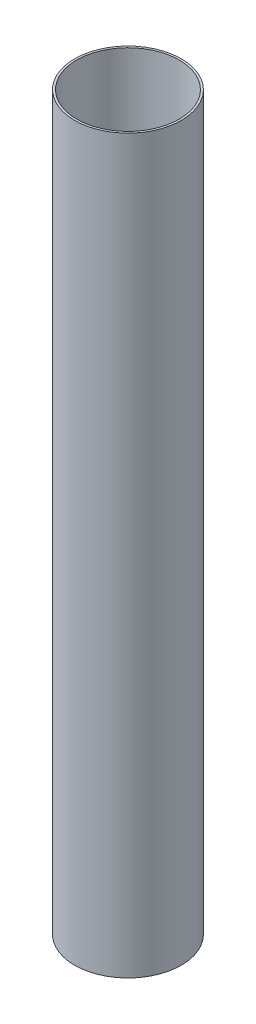
ISO-10303-21;
HEADER;
FILE_DESCRIPTION(('STEP AP214'),'2;1');
FILE_NAME('part.step','',(''),(''),'','','');
FILE_SCHEMA(('AUTOMOTIVE_DESIGN { 1 0 10303 214 1 1 1 1 }'));
ENDSEC;
DATA;
#1=APPLICATION_CONTEXT('core data for automotive mechanical design processes');
#2=APPLICATION_PROTOCOL_DEFINITION('international standard','automotive_design',2000,#1);
#3=PRODUCT_CONTEXT('',#1,'mechanical');
#4=PRODUCT('Part','Part','',(#3));
#5=PRODUCT_RELATED_PRODUCT_CATEGORY('part','',(#4));
#6=PRODUCT_DEFINITION_FORMATION('','',#4);
#7=PRODUCT_DEFINITION_CONTEXT('part definition',#1,'design');
#8=PRODUCT_DEFINITION('design','',#6,#7);
#9=PRODUCT_DEFINITION_SHAPE('','',#8);
#10=(LENGTH_UNIT() NAMED_UNIT(*) SI_UNIT(.MILLI.,.METRE.));
#11=(NAMED_UNIT(*) PLANE_ANGLE_UNIT() SI_UNIT($,.RADIAN.));
#12=(NAMED_UNIT(*) SI_UNIT($,.STERADIAN.) SOLID_ANGLE_UNIT());
#13=UNCERTAINTY_MEASURE_WITH_UNIT(LENGTH_MEASURE(1.E-05),#10,'distance_accuracy_value','');
#14=(GEOMETRIC_REPRESENTATION_CONTEXT(3) GLOBAL_UNCERTAINTY_ASSIGNED_CONTEXT((#13)) GLOBAL_UNIT_ASSIGNED_CONTEXT((#10,
#11,#12)) REPRESENTATION_CONTEXT('',''));
#15=CARTESIAN_POINT('',(0.,0.,0.));
#16=DIRECTION('',(0.,0.,1.));
#17=DIRECTION('',(1.,0.,0.));
#18=AXIS2_PLACEMENT_3D('',#15,#16,#17);
#19=CARTESIAN_POINT('',(0.,702.,0.));
#20=DIRECTION('',(0.,1.,0.));
#21=DIRECTION('',(0.,0.,1.));
#22=AXIS2_PLACEMENT_3D('',#19,#20,#21);
#23=PLANE('',#22);
#24=CARTESIAN_POINT('',(0.,702.,0.));
#25=DIRECTION('',(0.,1.,0.));
#26=DIRECTION('',(0.,0.,1.));
#27=AXIS2_PLACEMENT_3D('',#24,#25,#26);
#28=CIRCLE('',#27,51.2);
#29=CARTESIAN_POINT('',(0.,702.,51.2));
#30=VERTEX_POINT('',#29);
#31=EDGE_CURVE('E10',#30,#30,#28,.T.);
#32=ORIENTED_EDGE('',*,*,#31,.T.);
#33=EDGE_LOOP('',(#32));
#34=FACE_BOUND('',#33,.T.);
#35=CARTESIAN_POINT('',(0.,702.,0.));
#36=DIRECTION('',(0.,1.,0.));
#37=DIRECTION('',(0.,0.,1.));
#38=AXIS2_PLACEMENT_3D('',#35,#36,#37);
#39=CIRCLE('',#38,49.2);
#40=CARTESIAN_POINT('',(0.,702.,49.2));
#41=VERTEX_POINT('',#40);
#42=EDGE_CURVE('E52',#41,#41,#39,.T.);
#43=ORIENTED_EDGE('',*,*,#42,.F.);
#44=EDGE_LOOP('',(#43));
#45=FACE_BOUND('',#44,.T.);
#46=ADVANCED_FACE('F39',(#34,#45),#23,.T.);
#47=CARTESIAN_POINT('',(0.,0.,0.));
#48=DIRECTION('',(0.,1.,0.));
#49=DIRECTION('',(0.,0.,1.));
#50=AXIS2_PLACEMENT_3D('',#47,#48,#49);
#51=PLANE('',#50);
#52=CARTESIAN_POINT('',(0.,0.,0.));
#53=DIRECTION('',(0.,1.,0.));
#54=DIRECTION('',(0.,0.,1.));
#55=AXIS2_PLACEMENT_3D('',#52,#53,#54);
#56=CIRCLE('',#55,51.2);
#57=CARTESIAN_POINT('',(0.,0.,51.2));
#58=VERTEX_POINT('',#57);
#59=EDGE_CURVE('E43',#58,#58,#56,.T.);
#60=ORIENTED_EDGE('',*,*,#59,.F.);
#61=EDGE_LOOP('',(#60));
#62=FACE_BOUND('',#61,.T.);
#63=CARTESIAN_POINT('',(0.,0.,0.));
#64=DIRECTION('',(0.,1.,0.));
#65=DIRECTION('',(0.,0.,1.));
#66=AXIS2_PLACEMENT_3D('',#63,#64,#65);
#67=CIRCLE('',#66,49.2);
#68=CARTESIAN_POINT('',(0.,0.,49.2));
#69=VERTEX_POINT('',#68);
#70=EDGE_CURVE('E54',#69,#69,#67,.T.);
#71=ORIENTED_EDGE('',*,*,#70,.T.);
#72=EDGE_LOOP('',(#71));
#73=FACE_BOUND('',#72,.T.);
#74=ADVANCED_FACE('F66',(#62,#73),#51,.F.);
#75=CARTESIAN_POINT('',(0.,702.,0.));
#76=DIRECTION('',(0.,-1.,0.));
#77=DIRECTION('',(0.,0.,-1.));
#78=AXIS2_PLACEMENT_3D('',#75,#76,#77);
#79=CYLINDRICAL_SURFACE('',#78,51.2);
#80=ORIENTED_EDGE('',*,*,#31,.F.);
#81=EDGE_LOOP('',(#80));
#82=FACE_BOUND('',#81,.T.);
#83=ORIENTED_EDGE('',*,*,#59,.T.);
#84=EDGE_LOOP('',(#83));
#85=FACE_BOUND('',#84,.T.);
#86=ADVANCED_FACE('F41',(#82,#85),#79,.T.);
#87=CARTESIAN_POINT('',(0.,702.,0.));
#88=DIRECTION('',(0.,-1.,0.));
#89=DIRECTION('',(0.,0.,-1.));
#90=AXIS2_PLACEMENT_3D('',#87,#88,#89);
#91=CYLINDRICAL_SURFACE('',#90,49.2);
#92=ORIENTED_EDGE('',*,*,#42,.T.);
#93=EDGE_LOOP('',(#92));
#94=FACE_BOUND('',#93,.T.);
#95=ORIENTED_EDGE('',*,*,#70,.F.);
#96=EDGE_LOOP('',(#95));
#97=FACE_BOUND('',#96,.T.);
#98=ADVANCED_FACE('F62',(#94,#97),#91,.F.);
#99=CLOSED_SHELL('',(#46,#74,#86,#98));
#100=MANIFOLD_SOLID_BREP('B2',#99);
#101=ADVANCED_BREP_SHAPE_REPRESENTATION('',(#18,#100),#14);
#102=SHAPE_DEFINITION_REPRESENTATION(#9,#101);
ENDSEC;
END-ISO-10303-21;
